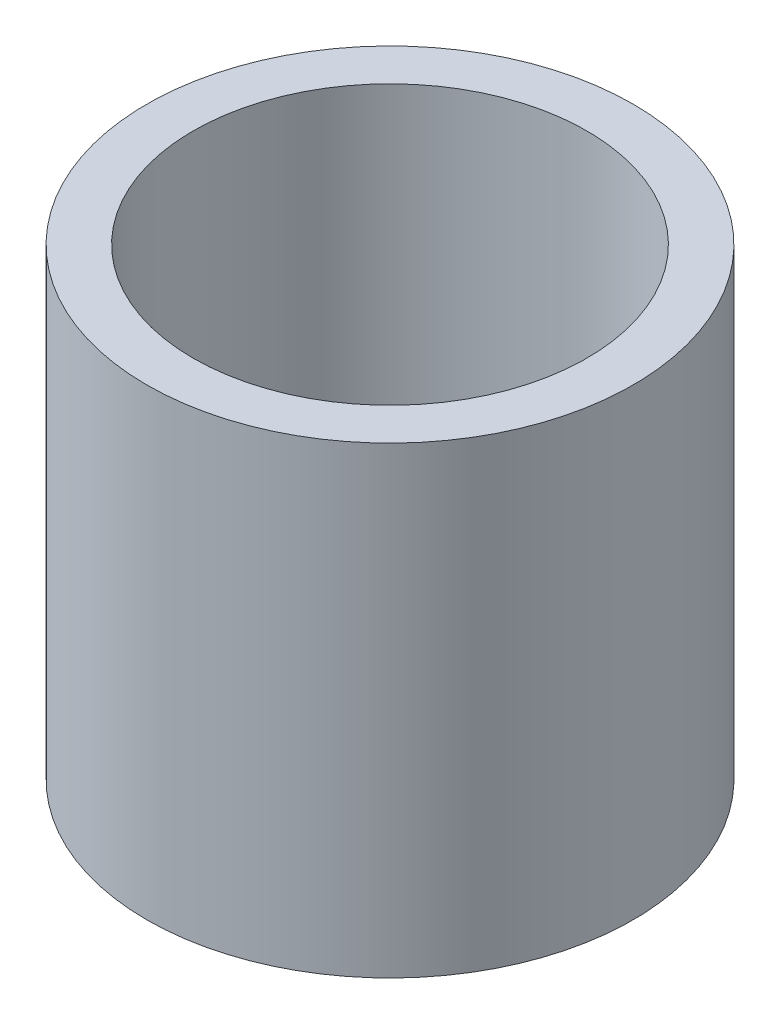
ISO-10303-21;
HEADER;
FILE_DESCRIPTION(('STEP AP214'),'2;1');
FILE_NAME('part.step','',(''),(''),'','','');
FILE_SCHEMA(('AUTOMOTIVE_DESIGN { 1 0 10303 214 1 1 1 1 }'));
ENDSEC;
DATA;
#1=APPLICATION_CONTEXT('core data for automotive mechanical design processes');
#2=APPLICATION_PROTOCOL_DEFINITION('international standard','automotive_design',2000,#1);
#3=PRODUCT_CONTEXT('',#1,'mechanical');
#4=PRODUCT('Part','Part','',(#3));
#5=PRODUCT_RELATED_PRODUCT_CATEGORY('part','',(#4));
#6=PRODUCT_DEFINITION_FORMATION('','',#4);
#7=PRODUCT_DEFINITION_CONTEXT('part definition',#1,'design');
#8=PRODUCT_DEFINITION('design','',#6,#7);
#9=PRODUCT_DEFINITION_SHAPE('','',#8);
#10=(LENGTH_UNIT() NAMED_UNIT(*) SI_UNIT(.MILLI.,.METRE.));
#11=(NAMED_UNIT(*) PLANE_ANGLE_UNIT() SI_UNIT($,.RADIAN.));
#12=(NAMED_UNIT(*) SI_UNIT($,.STERADIAN.) SOLID_ANGLE_UNIT());
#13=UNCERTAINTY_MEASURE_WITH_UNIT(LENGTH_MEASURE(1.E-05),#10,'distance_accuracy_value','');
#14=(GEOMETRIC_REPRESENTATION_CONTEXT(3) GLOBAL_UNCERTAINTY_ASSIGNED_CONTEXT((#13)) GLOBAL_UNIT_ASSIGNED_CONTEXT((#10,
#11,#12)) REPRESENTATION_CONTEXT('',''));
#15=CARTESIAN_POINT('',(0.,0.,0.));
#16=DIRECTION('',(0.,0.,1.));
#17=DIRECTION('',(1.,0.,0.));
#18=AXIS2_PLACEMENT_3D('',#15,#16,#17);
#19=CARTESIAN_POINT('',(0.,6.,0.));
#20=DIRECTION('',(0.,1.,0.));
#21=DIRECTION('',(0.,0.,1.));
#22=AXIS2_PLACEMENT_3D('',#19,#20,#21);
#23=PLANE('',#22);
#24=CARTESIAN_POINT('',(0.,6.,0.));
#25=DIRECTION('',(0.,1.,0.));
#26=DIRECTION('',(0.,0.,1.));
#27=AXIS2_PLACEMENT_3D('',#24,#25,#26);
#28=CIRCLE('',#27,3.15);
#29=CARTESIAN_POINT('',(0.,6.,3.15));
#30=VERTEX_POINT('',#29);
#31=EDGE_CURVE('E10',#30,#30,#28,.T.);
#32=ORIENTED_EDGE('',*,*,#31,.T.);
#33=EDGE_LOOP('',(#32));
#34=FACE_BOUND('',#33,.T.);
#35=CARTESIAN_POINT('',(0.,6.,0.));
#36=DIRECTION('',(0.,1.,0.));
#37=DIRECTION('',(0.,0.,1.));
#38=AXIS2_PLACEMENT_3D('',#35,#36,#37);
#39=CIRCLE('',#38,2.55);
#40=CARTESIAN_POINT('',(0.,6.,2.55));
#41=VERTEX_POINT('',#40);
#42=EDGE_CURVE('E43',#41,#41,#39,.T.);
#43=ORIENTED_EDGE('',*,*,#42,.F.);
#44=EDGE_LOOP('',(#43));
#45=FACE_BOUND('',#44,.T.);
#46=ADVANCED_FACE('F32',(#34,#45),#23,.T.);
#47=CARTESIAN_POINT('',(0.,0.,0.));
#48=DIRECTION('',(0.,1.,0.));
#49=DIRECTION('',(0.,0.,1.));
#50=AXIS2_PLACEMENT_3D('',#47,#48,#49);
#51=PLANE('',#50);
#52=CARTESIAN_POINT('',(0.,0.,0.));
#53=DIRECTION('',(0.,1.,0.));
#54=DIRECTION('',(0.,0.,1.));
#55=AXIS2_PLACEMENT_3D('',#52,#53,#54);
#56=CIRCLE('',#55,3.15);
#57=CARTESIAN_POINT('',(0.,0.,3.15));
#58=VERTEX_POINT('',#57);
#59=EDGE_CURVE('E36',#58,#58,#56,.T.);
#60=ORIENTED_EDGE('',*,*,#59,.F.);
#61=EDGE_LOOP('',(#60));
#62=FACE_BOUND('',#61,.T.);
#63=CARTESIAN_POINT('',(0.,0.,0.));
#64=DIRECTION('',(0.,1.,0.));
#65=DIRECTION('',(0.,0.,1.));
#66=AXIS2_PLACEMENT_3D('',#63,#64,#65);
#67=CIRCLE('',#66,2.55);
#68=CARTESIAN_POINT('',(0.,0.,2.55));
#69=VERTEX_POINT('',#68);
#70=EDGE_CURVE('E45',#69,#69,#67,.T.);
#71=ORIENTED_EDGE('',*,*,#70,.T.);
#72=EDGE_LOOP('',(#71));
#73=FACE_BOUND('',#72,.T.);
#74=ADVANCED_FACE('F55',(#62,#73),#51,.F.);
#75=CARTESIAN_POINT('',(0.,6.,0.));
#76=DIRECTION('',(0.,-1.,0.));
#77=DIRECTION('',(0.,0.,-1.));
#78=AXIS2_PLACEMENT_3D('',#75,#76,#77);
#79=CYLINDRICAL_SURFACE('',#78,3.15);
#80=ORIENTED_EDGE('',*,*,#31,.F.);
#81=EDGE_LOOP('',(#80));
#82=FACE_BOUND('',#81,.T.);
#83=ORIENTED_EDGE('',*,*,#59,.T.);
#84=EDGE_LOOP('',(#83));
#85=FACE_BOUND('',#84,.T.);
#86=ADVANCED_FACE('F34',(#82,#85),#79,.T.);
#87=CARTESIAN_POINT('',(0.,6.,0.));
#88=DIRECTION('',(0.,-1.,0.));
#89=DIRECTION('',(0.,0.,-1.));
#90=AXIS2_PLACEMENT_3D('',#87,#88,#89);
#91=CYLINDRICAL_SURFACE('',#90,2.55);
#92=ORIENTED_EDGE('',*,*,#42,.T.);
#93=EDGE_LOOP('',(#92));
#94=FACE_BOUND('',#93,.T.);
#95=ORIENTED_EDGE('',*,*,#70,.F.);
#96=EDGE_LOOP('',(#95));
#97=FACE_BOUND('',#96,.T.);
#98=ADVANCED_FACE('F51',(#94,#97),#91,.F.);
#99=CLOSED_SHELL('',(#46,#74,#86,#98));
#100=MANIFOLD_SOLID_BREP('B2',#99);
#101=ADVANCED_BREP_SHAPE_REPRESENTATION('',(#18,#100),#14);
#102=SHAPE_DEFINITION_REPRESENTATION(#9,#101);
ENDSEC;
END-ISO-10303-21;
